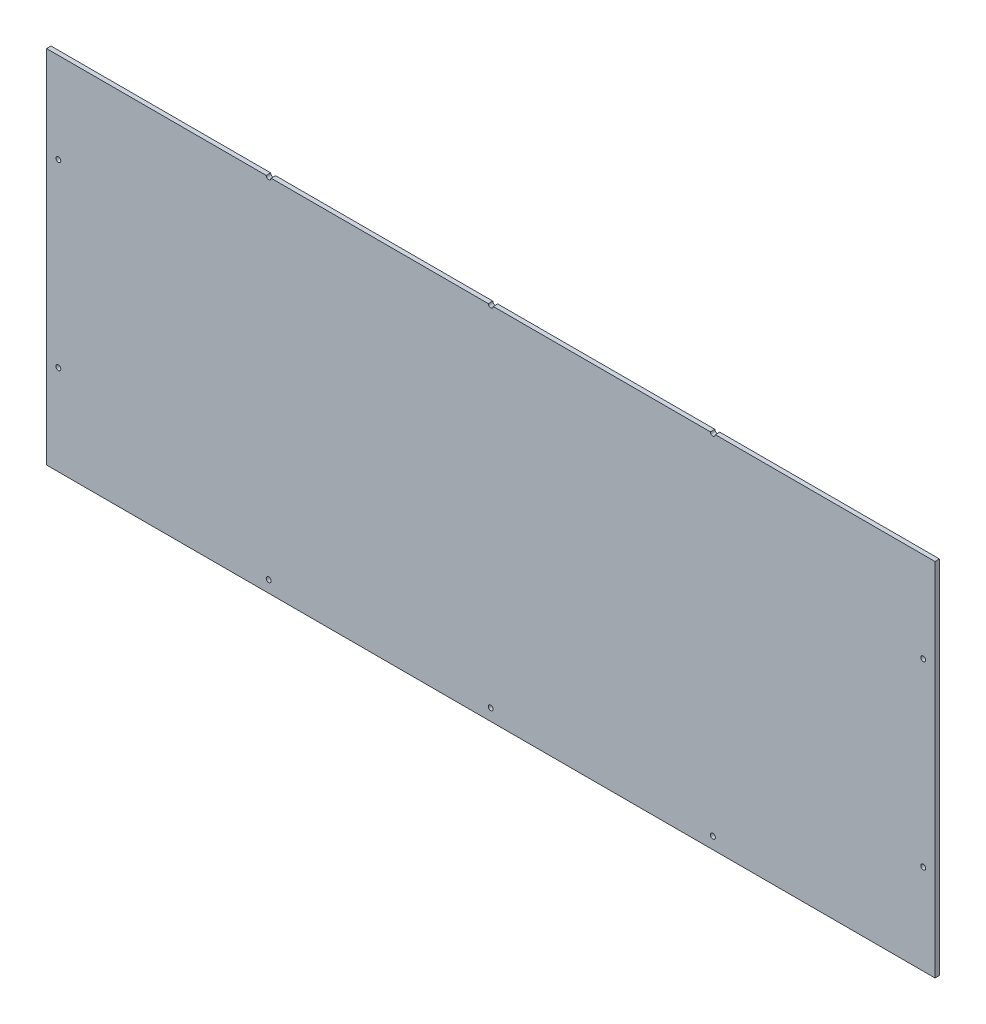
ISO-10303-21;
HEADER;
FILE_DESCRIPTION(('STEP AP214'),'2;1');
FILE_NAME('part.step','',(''),(''),'','','');
FILE_SCHEMA(('AUTOMOTIVE_DESIGN { 1 0 10303 214 1 1 1 1 }'));
ENDSEC;
DATA;
#1=APPLICATION_CONTEXT('core data for automotive mechanical design processes');
#2=APPLICATION_PROTOCOL_DEFINITION('international standard','automotive_design',2000,#1);
#3=PRODUCT_CONTEXT('',#1,'mechanical');
#4=PRODUCT('Part','Part','',(#3));
#5=PRODUCT_RELATED_PRODUCT_CATEGORY('part','',(#4));
#6=PRODUCT_DEFINITION_FORMATION('','',#4);
#7=PRODUCT_DEFINITION_CONTEXT('part definition',#1,'design');
#8=PRODUCT_DEFINITION('design','',#6,#7);
#9=PRODUCT_DEFINITION_SHAPE('','',#8);
#10=(LENGTH_UNIT() NAMED_UNIT(*) SI_UNIT(.MILLI.,.METRE.));
#11=(NAMED_UNIT(*) PLANE_ANGLE_UNIT() SI_UNIT($,.RADIAN.));
#12=(NAMED_UNIT(*) SI_UNIT($,.STERADIAN.) SOLID_ANGLE_UNIT());
#13=UNCERTAINTY_MEASURE_WITH_UNIT(LENGTH_MEASURE(1.E-05),#10,'distance_accuracy_value','');
#14=(GEOMETRIC_REPRESENTATION_CONTEXT(3) GLOBAL_UNCERTAINTY_ASSIGNED_CONTEXT((#13)) GLOBAL_UNIT_ASSIGNED_CONTEXT((#10,
#11,#12)) REPRESENTATION_CONTEXT('',''));
#15=CARTESIAN_POINT('',(0.,0.,0.));
#16=DIRECTION('',(0.,0.,1.));
#17=DIRECTION('',(1.,0.,0.));
#18=AXIS2_PLACEMENT_3D('',#15,#16,#17);
#19=CARTESIAN_POINT('',(226.,183.5,4.5));
#20=DIRECTION('',(0.,0.,1.));
#21=DIRECTION('',(1.,0.,0.));
#22=AXIS2_PLACEMENT_3D('',#19,#20,#21);
#23=PLANE('',#22);
#24=CARTESIAN_POINT('',(-439.999999999999,-91.75,4.5));
#25=DIRECTION('',(0.,0.,1.));
#26=DIRECTION('',(1.,0.,0.));
#27=AXIS2_PLACEMENT_3D('',#24,#25,#26);
#28=CIRCLE('',#27,2.50000000000002);
#29=CARTESIAN_POINT('',(-437.499999999999,-91.75,4.5));
#30=VERTEX_POINT('',#29);
#31=EDGE_CURVE('E240',#30,#30,#28,.T.);
#32=ORIENTED_EDGE('',*,*,#31,.F.);
#33=EDGE_LOOP('',(#32));
#34=FACE_BOUND('',#33,.T.);
#35=CARTESIAN_POINT('',(-440.,91.75,4.5));
#36=DIRECTION('',(0.,0.,1.));
#37=DIRECTION('',(1.,0.,0.));
#38=AXIS2_PLACEMENT_3D('',#35,#36,#37);
#39=CIRCLE('',#38,2.50000000000002);
#40=CARTESIAN_POINT('',(-437.5,91.75,4.5));
#41=VERTEX_POINT('',#40);
#42=EDGE_CURVE('E228',#41,#41,#39,.T.);
#43=ORIENTED_EDGE('',*,*,#42,.F.);
#44=EDGE_LOOP('',(#43));
#45=FACE_BOUND('',#44,.T.);
#46=CARTESIAN_POINT('',(226.,-171.499999999998,4.5));
#47=DIRECTION('',(0.,0.,1.));
#48=DIRECTION('',(1.,0.,0.));
#49=AXIS2_PLACEMENT_3D('',#46,#47,#48);
#50=CIRCLE('',#49,2.5);
#51=CARTESIAN_POINT('',(228.5,-171.499999999998,4.5));
#52=VERTEX_POINT('',#51);
#53=EDGE_CURVE('E216',#52,#52,#50,.T.);
#54=ORIENTED_EDGE('',*,*,#53,.F.);
#55=EDGE_LOOP('',(#54));
#56=FACE_BOUND('',#55,.T.);
#57=DIRECTION('',(0.,-1.,0.));
#58=VECTOR('',#57,1.);
#59=CARTESIAN_POINT('',(-452.000000000001,183.499999999997,4.5));
#60=LINE('',#59,#58);
#61=CARTESIAN_POINT('',(-452.000000000001,183.499999999997,4.5));
#62=VERTEX_POINT('',#61);
#63=CARTESIAN_POINT('',(-451.999999999999,-183.5,4.5));
#64=VERTEX_POINT('',#63);
#65=EDGE_CURVE('E165',#62,#64,#60,.T.);
#66=ORIENTED_EDGE('',*,*,#65,.T.);
#67=DIRECTION('',(1.,0.,0.));
#68=VECTOR('',#67,1.);
#69=CARTESIAN_POINT('',(-451.999999999999,-183.5,4.5));
#70=LINE('',#69,#68);
#71=CARTESIAN_POINT('',(452.000000000001,-183.499999999997,4.5));
#72=VERTEX_POINT('',#71);
#73=EDGE_CURVE('E103',#64,#72,#70,.T.);
#74=ORIENTED_EDGE('',*,*,#73,.T.);
#75=DIRECTION('',(0.,1.,0.));
#76=VECTOR('',#75,1.);
#77=CARTESIAN_POINT('',(451.999999999999,183.500000000003,4.5));
#78=LINE('',#77,#76);
#79=CARTESIAN_POINT('',(451.999999999999,183.500000000003,4.5));
#80=VERTEX_POINT('',#79);
#81=EDGE_CURVE('E186',#72,#80,#78,.T.);
#82=ORIENTED_EDGE('',*,*,#81,.T.);
#83=DIRECTION('',(-1.,0.,0.));
#84=VECTOR('',#83,1.);
#85=CARTESIAN_POINT('',(228.5,183.5,4.5));
#86=LINE('',#85,#84);
#87=CARTESIAN_POINT('',(228.5,183.5,4.5));
#88=VERTEX_POINT('',#87);
#89=EDGE_CURVE('E205',#80,#88,#86,.T.);
#90=ORIENTED_EDGE('',*,*,#89,.T.);
#91=CARTESIAN_POINT('',(226.,183.5,4.5));
#92=DIRECTION('',(0.,0.,-1.));
#93=DIRECTION('',(1.,0.,0.));
#94=AXIS2_PLACEMENT_3D('',#91,#92,#93);
#95=CIRCLE('',#94,2.5);
#96=CARTESIAN_POINT('',(223.5,183.5,4.5));
#97=VERTEX_POINT('',#96);
#98=EDGE_CURVE('E202',#88,#97,#95,.T.);
#99=ORIENTED_EDGE('',*,*,#98,.T.);
#100=DIRECTION('',(-1.,0.,0.));
#101=VECTOR('',#100,1.);
#102=CARTESIAN_POINT('',(2.50000000000006,183.5,4.5));
#103=LINE('',#102,#101);
#104=CARTESIAN_POINT('',(2.50000000000006,183.5,4.5));
#105=VERTEX_POINT('',#104);
#106=EDGE_CURVE('E204',#97,#105,#103,.T.);
#107=ORIENTED_EDGE('',*,*,#106,.T.);
#108=CARTESIAN_POINT('',(0.,183.5,4.5));
#109=DIRECTION('',(0.,0.,-1.));
#110=DIRECTION('',(1.,0.,0.));
#111=AXIS2_PLACEMENT_3D('',#108,#109,#110);
#112=CIRCLE('',#111,2.5);
#113=CARTESIAN_POINT('',(-2.49999999999995,183.5,4.5));
#114=VERTEX_POINT('',#113);
#115=EDGE_CURVE('E128',#105,#114,#112,.T.);
#116=ORIENTED_EDGE('',*,*,#115,.T.);
#117=DIRECTION('',(-1.,0.,0.));
#118=VECTOR('',#117,1.);
#119=CARTESIAN_POINT('',(-223.5,183.499999999998,4.5));
#120=LINE('',#119,#118);
#121=CARTESIAN_POINT('',(-223.5,183.499999999998,4.5));
#122=VERTEX_POINT('',#121);
#123=EDGE_CURVE('E122',#114,#122,#120,.T.);
#124=ORIENTED_EDGE('',*,*,#123,.T.);
#125=CARTESIAN_POINT('',(-226.,183.499999999998,4.5));
#126=DIRECTION('',(0.,0.,-1.));
#127=DIRECTION('',(1.,0.,0.));
#128=AXIS2_PLACEMENT_3D('',#125,#126,#127);
#129=CIRCLE('',#128,2.5);
#130=CARTESIAN_POINT('',(-228.5,183.499999999998,4.5));
#131=VERTEX_POINT('',#130);
#132=EDGE_CURVE('E126',#122,#131,#129,.T.);
#133=ORIENTED_EDGE('',*,*,#132,.T.);
#134=DIRECTION('',(-1.,0.,0.));
#135=VECTOR('',#134,1.);
#136=CARTESIAN_POINT('',(-452.000000000001,183.499999999997,4.5));
#137=LINE('',#136,#135);
#138=EDGE_CURVE('E54',#131,#62,#137,.T.);
#139=ORIENTED_EDGE('',*,*,#138,.T.);
#140=EDGE_LOOP('',(#66,#74,#82,#90,#99,#107,#116,#124,#133,#139));
#141=FACE_BOUND('',#140,.T.);
#142=CARTESIAN_POINT('',(0.,-171.499999999998,4.5));
#143=DIRECTION('',(0.,0.,1.));
#144=DIRECTION('',(1.,0.,0.));
#145=AXIS2_PLACEMENT_3D('',#142,#143,#144);
#146=CIRCLE('',#145,2.5);
#147=CARTESIAN_POINT('',(2.50000000000006,-171.499999999998,4.5));
#148=VERTEX_POINT('',#147);
#149=EDGE_CURVE('E150',#148,#148,#146,.T.);
#150=ORIENTED_EDGE('',*,*,#149,.F.);
#151=EDGE_LOOP('',(#150));
#152=FACE_BOUND('',#151,.T.);
#153=CARTESIAN_POINT('',(-226.,-171.5,4.5));
#154=DIRECTION('',(0.,0.,1.));
#155=DIRECTION('',(1.,0.,0.));
#156=AXIS2_PLACEMENT_3D('',#153,#154,#155);
#157=CIRCLE('',#156,2.5);
#158=CARTESIAN_POINT('',(-223.5,-171.5,4.5));
#159=VERTEX_POINT('',#158);
#160=EDGE_CURVE('E222',#159,#159,#157,.T.);
#161=ORIENTED_EDGE('',*,*,#160,.F.);
#162=EDGE_LOOP('',(#161));
#163=FACE_BOUND('',#162,.T.);
#164=CARTESIAN_POINT('',(439.999999999999,-91.75,4.5));
#165=DIRECTION('',(0.,0.,1.));
#166=DIRECTION('',(-1.,0.,0.));
#167=AXIS2_PLACEMENT_3D('',#164,#165,#166);
#168=CIRCLE('',#167,2.50000000000002);
#169=CARTESIAN_POINT('',(437.499999999999,-91.75,4.5));
#170=VERTEX_POINT('',#169);
#171=EDGE_CURVE('E234',#170,#170,#168,.T.);
#172=ORIENTED_EDGE('',*,*,#171,.F.);
#173=EDGE_LOOP('',(#172));
#174=FACE_BOUND('',#173,.T.);
#175=CARTESIAN_POINT('',(440.,91.75,4.5));
#176=DIRECTION('',(0.,0.,1.));
#177=DIRECTION('',(-1.,0.,0.));
#178=AXIS2_PLACEMENT_3D('',#175,#176,#177);
#179=CIRCLE('',#178,2.50000000000002);
#180=CARTESIAN_POINT('',(437.5,91.75,4.5));
#181=VERTEX_POINT('',#180);
#182=EDGE_CURVE('E246',#181,#181,#179,.T.);
#183=ORIENTED_EDGE('',*,*,#182,.F.);
#184=EDGE_LOOP('',(#183));
#185=FACE_BOUND('',#184,.T.);
#186=ADVANCED_FACE('F37',(#34,#45,#56,#141,#152,#163,#174,#185),#23,.T.);
#187=CARTESIAN_POINT('',(226.,183.5,0.));
#188=DIRECTION('',(0.,0.,1.));
#189=DIRECTION('',(1.,0.,0.));
#190=AXIS2_PLACEMENT_3D('',#187,#188,#189);
#191=PLANE('',#190);
#192=DIRECTION('',(0.,-1.,0.));
#193=VECTOR('',#192,1.);
#194=CARTESIAN_POINT('',(-452.000000000001,183.499999999997,0.));
#195=LINE('',#194,#193);
#196=CARTESIAN_POINT('',(-452.000000000001,183.499999999997,0.));
#197=VERTEX_POINT('',#196);
#198=CARTESIAN_POINT('',(-451.999999999999,-183.5,0.));
#199=VERTEX_POINT('',#198);
#200=EDGE_CURVE('E146',#197,#199,#195,.T.);
#201=ORIENTED_EDGE('',*,*,#200,.F.);
#202=DIRECTION('',(-1.,0.,0.));
#203=VECTOR('',#202,1.);
#204=CARTESIAN_POINT('',(-452.000000000001,183.499999999997,0.));
#205=LINE('',#204,#203);
#206=CARTESIAN_POINT('',(-228.5,183.499999999998,0.));
#207=VERTEX_POINT('',#206);
#208=EDGE_CURVE('E95',#207,#197,#205,.T.);
#209=ORIENTED_EDGE('',*,*,#208,.F.);
#210=CARTESIAN_POINT('',(-226.,183.499999999998,0.));
#211=DIRECTION('',(0.,0.,-1.));
#212=DIRECTION('',(1.,0.,0.));
#213=AXIS2_PLACEMENT_3D('',#210,#211,#212);
#214=CIRCLE('',#213,2.5);
#215=CARTESIAN_POINT('',(-223.5,183.499999999998,0.));
#216=VERTEX_POINT('',#215);
#217=EDGE_CURVE('E89',#216,#207,#214,.T.);
#218=ORIENTED_EDGE('',*,*,#217,.F.);
#219=DIRECTION('',(-1.,0.,0.));
#220=VECTOR('',#219,1.);
#221=CARTESIAN_POINT('',(-223.5,183.499999999998,0.));
#222=LINE('',#221,#220);
#223=CARTESIAN_POINT('',(-2.49999999999995,183.5,0.));
#224=VERTEX_POINT('',#223);
#225=EDGE_CURVE('E136',#224,#216,#222,.T.);
#226=ORIENTED_EDGE('',*,*,#225,.F.);
#227=CARTESIAN_POINT('',(0.,183.5,0.));
#228=DIRECTION('',(0.,0.,-1.));
#229=DIRECTION('',(1.,0.,0.));
#230=AXIS2_PLACEMENT_3D('',#227,#228,#229);
#231=CIRCLE('',#230,2.5);
#232=CARTESIAN_POINT('',(2.50000000000006,183.5,0.));
#233=VERTEX_POINT('',#232);
#234=EDGE_CURVE('E160',#233,#224,#231,.T.);
#235=ORIENTED_EDGE('',*,*,#234,.F.);
#236=DIRECTION('',(-1.,0.,0.));
#237=VECTOR('',#236,1.);
#238=CARTESIAN_POINT('',(2.50000000000006,183.5,0.));
#239=LINE('',#238,#237);
#240=CARTESIAN_POINT('',(223.5,183.5,0.));
#241=VERTEX_POINT('',#240);
#242=EDGE_CURVE('E158',#241,#233,#239,.T.);
#243=ORIENTED_EDGE('',*,*,#242,.F.);
#244=CARTESIAN_POINT('',(226.,183.5,0.));
#245=DIRECTION('',(0.,0.,-1.));
#246=DIRECTION('',(1.,0.,0.));
#247=AXIS2_PLACEMENT_3D('',#244,#245,#246);
#248=CIRCLE('',#247,2.5);
#249=CARTESIAN_POINT('',(228.5,183.5,0.));
#250=VERTEX_POINT('',#249);
#251=EDGE_CURVE('E156',#250,#241,#248,.T.);
#252=ORIENTED_EDGE('',*,*,#251,.F.);
#253=DIRECTION('',(-1.,0.,0.));
#254=VECTOR('',#253,1.);
#255=CARTESIAN_POINT('',(228.5,183.5,0.));
#256=LINE('',#255,#254);
#257=CARTESIAN_POINT('',(451.999999999999,183.500000000003,0.));
#258=VERTEX_POINT('',#257);
#259=EDGE_CURVE('E154',#258,#250,#256,.T.);
#260=ORIENTED_EDGE('',*,*,#259,.F.);
#261=DIRECTION('',(0.,1.,0.));
#262=VECTOR('',#261,1.);
#263=CARTESIAN_POINT('',(451.999999999999,183.500000000003,0.));
#264=LINE('',#263,#262);
#265=CARTESIAN_POINT('',(452.000000000001,-183.499999999997,0.));
#266=VERTEX_POINT('',#265);
#267=EDGE_CURVE('E152',#266,#258,#264,.T.);
#268=ORIENTED_EDGE('',*,*,#267,.F.);
#269=DIRECTION('',(1.,0.,0.));
#270=VECTOR('',#269,1.);
#271=CARTESIAN_POINT('',(-451.999999999999,-183.5,0.));
#272=LINE('',#271,#270);
#273=EDGE_CURVE('E149',#199,#266,#272,.T.);
#274=ORIENTED_EDGE('',*,*,#273,.F.);
#275=EDGE_LOOP('',(#201,#209,#218,#226,#235,#243,#252,#260,#268,#274));
#276=FACE_BOUND('',#275,.T.);
#277=CARTESIAN_POINT('',(0.,-171.499999999998,0.));
#278=DIRECTION('',(0.,0.,1.));
#279=DIRECTION('',(1.,0.,0.));
#280=AXIS2_PLACEMENT_3D('',#277,#278,#279);
#281=CIRCLE('',#280,2.5);
#282=CARTESIAN_POINT('',(2.50000000000006,-171.499999999998,0.));
#283=VERTEX_POINT('',#282);
#284=EDGE_CURVE('E213',#283,#283,#281,.T.);
#285=ORIENTED_EDGE('',*,*,#284,.T.);
#286=EDGE_LOOP('',(#285));
#287=FACE_BOUND('',#286,.T.);
#288=CARTESIAN_POINT('',(226.,-171.499999999998,0.));
#289=DIRECTION('',(0.,0.,1.));
#290=DIRECTION('',(1.,0.,0.));
#291=AXIS2_PLACEMENT_3D('',#288,#289,#290);
#292=CIRCLE('',#291,2.5);
#293=CARTESIAN_POINT('',(228.5,-171.499999999998,0.));
#294=VERTEX_POINT('',#293);
#295=EDGE_CURVE('E219',#294,#294,#292,.T.);
#296=ORIENTED_EDGE('',*,*,#295,.T.);
#297=EDGE_LOOP('',(#296));
#298=FACE_BOUND('',#297,.T.);
#299=CARTESIAN_POINT('',(-226.,-171.5,0.));
#300=DIRECTION('',(0.,0.,1.));
#301=DIRECTION('',(1.,0.,0.));
#302=AXIS2_PLACEMENT_3D('',#299,#300,#301);
#303=CIRCLE('',#302,2.5);
#304=CARTESIAN_POINT('',(-223.5,-171.5,0.));
#305=VERTEX_POINT('',#304);
#306=EDGE_CURVE('E225',#305,#305,#303,.T.);
#307=ORIENTED_EDGE('',*,*,#306,.T.);
#308=EDGE_LOOP('',(#307));
#309=FACE_BOUND('',#308,.T.);
#310=CARTESIAN_POINT('',(-440.,91.75,0.));
#311=DIRECTION('',(0.,0.,1.));
#312=DIRECTION('',(1.,0.,0.));
#313=AXIS2_PLACEMENT_3D('',#310,#311,#312);
#314=CIRCLE('',#313,2.50000000000002);
#315=CARTESIAN_POINT('',(-437.5,91.75,0.));
#316=VERTEX_POINT('',#315);
#317=EDGE_CURVE('E231',#316,#316,#314,.T.);
#318=ORIENTED_EDGE('',*,*,#317,.T.);
#319=EDGE_LOOP('',(#318));
#320=FACE_BOUND('',#319,.T.);
#321=CARTESIAN_POINT('',(439.999999999999,-91.75,0.));
#322=DIRECTION('',(0.,0.,1.));
#323=DIRECTION('',(-1.,0.,0.));
#324=AXIS2_PLACEMENT_3D('',#321,#322,#323);
#325=CIRCLE('',#324,2.50000000000002);
#326=CARTESIAN_POINT('',(437.499999999999,-91.75,0.));
#327=VERTEX_POINT('',#326);
#328=EDGE_CURVE('E237',#327,#327,#325,.T.);
#329=ORIENTED_EDGE('',*,*,#328,.T.);
#330=EDGE_LOOP('',(#329));
#331=FACE_BOUND('',#330,.T.);
#332=CARTESIAN_POINT('',(-439.999999999999,-91.75,0.));
#333=DIRECTION('',(0.,0.,1.));
#334=DIRECTION('',(1.,0.,0.));
#335=AXIS2_PLACEMENT_3D('',#332,#333,#334);
#336=CIRCLE('',#335,2.50000000000002);
#337=CARTESIAN_POINT('',(-437.499999999999,-91.75,0.));
#338=VERTEX_POINT('',#337);
#339=EDGE_CURVE('E243',#338,#338,#336,.T.);
#340=ORIENTED_EDGE('',*,*,#339,.T.);
#341=EDGE_LOOP('',(#340));
#342=FACE_BOUND('',#341,.T.);
#343=CARTESIAN_POINT('',(440.,91.75,0.));
#344=DIRECTION('',(0.,0.,1.));
#345=DIRECTION('',(-1.,0.,0.));
#346=AXIS2_PLACEMENT_3D('',#343,#344,#345);
#347=CIRCLE('',#346,2.50000000000002);
#348=CARTESIAN_POINT('',(437.5,91.75,0.));
#349=VERTEX_POINT('',#348);
#350=EDGE_CURVE('E249',#349,#349,#347,.T.);
#351=ORIENTED_EDGE('',*,*,#350,.T.);
#352=EDGE_LOOP('',(#351));
#353=FACE_BOUND('',#352,.T.);
#354=ADVANCED_FACE('F190',(#276,#287,#298,#309,#320,#331,#342,#353),#191,.F.);
#355=CARTESIAN_POINT('',(-452.000000000001,183.499999999997,4.5));
#356=DIRECTION('',(1.,0.,0.));
#357=DIRECTION('',(0.,1.,0.));
#358=AXIS2_PLACEMENT_3D('',#355,#356,#357);
#359=PLANE('',#358);
#360=ORIENTED_EDGE('',*,*,#200,.T.);
#361=DIRECTION('',(0.,0.,-1.));
#362=VECTOR('',#361,1.);
#363=CARTESIAN_POINT('',(-451.999999999999,-183.5,4.5));
#364=LINE('',#363,#362);
#365=EDGE_CURVE('E11',#64,#199,#364,.T.);
#366=ORIENTED_EDGE('',*,*,#365,.F.);
#367=ORIENTED_EDGE('',*,*,#65,.F.);
#368=DIRECTION('',(0.,0.,-1.));
#369=VECTOR('',#368,1.);
#370=CARTESIAN_POINT('',(-452.000000000001,183.499999999997,4.5));
#371=LINE('',#370,#369);
#372=EDGE_CURVE('E142',#62,#197,#371,.T.);
#373=ORIENTED_EDGE('',*,*,#372,.T.);
#374=EDGE_LOOP('',(#360,#366,#367,#373));
#375=FACE_BOUND('',#374,.T.);
#376=ADVANCED_FACE('F39',(#375),#359,.F.);
#377=CARTESIAN_POINT('',(-451.999999999999,-183.5,4.5));
#378=DIRECTION('',(0.,1.,0.));
#379=DIRECTION('',(-1.,0.,0.));
#380=AXIS2_PLACEMENT_3D('',#377,#378,#379);
#381=PLANE('',#380);
#382=ORIENTED_EDGE('',*,*,#273,.T.);
#383=DIRECTION('',(0.,0.,-1.));
#384=VECTOR('',#383,1.);
#385=CARTESIAN_POINT('',(452.000000000001,-183.499999999997,4.5));
#386=LINE('',#385,#384);
#387=EDGE_CURVE('E46',#72,#266,#386,.T.);
#388=ORIENTED_EDGE('',*,*,#387,.F.);
#389=ORIENTED_EDGE('',*,*,#73,.F.);
#390=ORIENTED_EDGE('',*,*,#365,.T.);
#391=EDGE_LOOP('',(#382,#388,#389,#390));
#392=FACE_BOUND('',#391,.T.);
#393=ADVANCED_FACE('F291',(#392),#381,.F.);
#394=CARTESIAN_POINT('',(451.999999999999,183.500000000003,4.5));
#395=DIRECTION('',(-1.,0.,0.));
#396=DIRECTION('',(0.,-1.,0.));
#397=AXIS2_PLACEMENT_3D('',#394,#395,#396);
#398=PLANE('',#397);
#399=ORIENTED_EDGE('',*,*,#267,.T.);
#400=DIRECTION('',(0.,0.,-1.));
#401=VECTOR('',#400,1.);
#402=CARTESIAN_POINT('',(451.999999999999,183.500000000003,4.5));
#403=LINE('',#402,#401);
#404=EDGE_CURVE('E178',#80,#258,#403,.T.);
#405=ORIENTED_EDGE('',*,*,#404,.F.);
#406=ORIENTED_EDGE('',*,*,#81,.F.);
#407=ORIENTED_EDGE('',*,*,#387,.T.);
#408=EDGE_LOOP('',(#399,#405,#406,#407));
#409=FACE_BOUND('',#408,.T.);
#410=ADVANCED_FACE('F184',(#409),#398,.F.);
#411=CARTESIAN_POINT('',(228.5,183.5,4.5));
#412=DIRECTION('',(0.,-1.,0.));
#413=DIRECTION('',(1.,0.,0.));
#414=AXIS2_PLACEMENT_3D('',#411,#412,#413);
#415=PLANE('',#414);
#416=ORIENTED_EDGE('',*,*,#259,.T.);
#417=DIRECTION('',(0.,0.,-1.));
#418=VECTOR('',#417,1.);
#419=CARTESIAN_POINT('',(228.5,183.5,4.5));
#420=LINE('',#419,#418);
#421=EDGE_CURVE('E175',#88,#250,#420,.T.);
#422=ORIENTED_EDGE('',*,*,#421,.F.);
#423=ORIENTED_EDGE('',*,*,#89,.F.);
#424=ORIENTED_EDGE('',*,*,#404,.T.);
#425=EDGE_LOOP('',(#416,#422,#423,#424));
#426=FACE_BOUND('',#425,.T.);
#427=ADVANCED_FACE('F196',(#426),#415,.F.);
#428=CARTESIAN_POINT('',(226.,183.5,4.5));
#429=DIRECTION('',(0.,0.,-1.));
#430=DIRECTION('',(-1.,0.,0.));
#431=AXIS2_PLACEMENT_3D('',#428,#429,#430);
#432=CYLINDRICAL_SURFACE('',#431,2.5);
#433=ORIENTED_EDGE('',*,*,#251,.T.);
#434=DIRECTION('',(0.,0.,-1.));
#435=VECTOR('',#434,1.);
#436=CARTESIAN_POINT('',(223.5,183.5,4.5));
#437=LINE('',#436,#435);
#438=EDGE_CURVE('E172',#97,#241,#437,.T.);
#439=ORIENTED_EDGE('',*,*,#438,.F.);
#440=ORIENTED_EDGE('',*,*,#98,.F.);
#441=ORIENTED_EDGE('',*,*,#421,.T.);
#442=EDGE_LOOP('',(#433,#439,#440,#441));
#443=FACE_BOUND('',#442,.T.);
#444=ADVANCED_FACE('F200',(#443),#432,.F.);
#445=CARTESIAN_POINT('',(2.50000000000006,183.5,4.5));
#446=DIRECTION('',(0.,-1.,0.));
#447=DIRECTION('',(0.,0.,-1.));
#448=AXIS2_PLACEMENT_3D('',#445,#446,#447);
#449=PLANE('',#448);
#450=ORIENTED_EDGE('',*,*,#242,.T.);
#451=DIRECTION('',(0.,0.,-1.));
#452=VECTOR('',#451,1.);
#453=CARTESIAN_POINT('',(2.50000000000006,183.5,4.5));
#454=LINE('',#453,#452);
#455=EDGE_CURVE('E169',#105,#233,#454,.T.);
#456=ORIENTED_EDGE('',*,*,#455,.F.);
#457=ORIENTED_EDGE('',*,*,#106,.F.);
#458=ORIENTED_EDGE('',*,*,#438,.T.);
#459=EDGE_LOOP('',(#450,#456,#457,#458));
#460=FACE_BOUND('',#459,.T.);
#461=ADVANCED_FACE('F281',(#460),#449,.F.);
#462=CARTESIAN_POINT('',(0.,183.5,4.5));
#463=DIRECTION('',(0.,0.,-1.));
#464=DIRECTION('',(-1.,0.,0.));
#465=AXIS2_PLACEMENT_3D('',#462,#463,#464);
#466=CYLINDRICAL_SURFACE('',#465,2.5);
#467=ORIENTED_EDGE('',*,*,#234,.T.);
#468=DIRECTION('',(0.,0.,-1.));
#469=VECTOR('',#468,1.);
#470=CARTESIAN_POINT('',(-2.49999999999995,183.5,4.5));
#471=LINE('',#470,#469);
#472=EDGE_CURVE('E137',#114,#224,#471,.T.);
#473=ORIENTED_EDGE('',*,*,#472,.F.);
#474=ORIENTED_EDGE('',*,*,#115,.F.);
#475=ORIENTED_EDGE('',*,*,#455,.T.);
#476=EDGE_LOOP('',(#467,#473,#474,#475));
#477=FACE_BOUND('',#476,.T.);
#478=ADVANCED_FACE('F278',(#477),#466,.F.);
#479=CARTESIAN_POINT('',(-223.5,183.499999999998,4.5));
#480=DIRECTION('',(0.,-1.,0.));
#481=DIRECTION('',(1.,0.,0.));
#482=AXIS2_PLACEMENT_3D('',#479,#480,#481);
#483=PLANE('',#482);
#484=ORIENTED_EDGE('',*,*,#225,.T.);
#485=DIRECTION('',(0.,0.,-1.));
#486=VECTOR('',#485,1.);
#487=CARTESIAN_POINT('',(-223.5,183.499999999998,4.5));
#488=LINE('',#487,#486);
#489=EDGE_CURVE('E133',#122,#216,#488,.T.);
#490=ORIENTED_EDGE('',*,*,#489,.F.);
#491=ORIENTED_EDGE('',*,*,#123,.F.);
#492=ORIENTED_EDGE('',*,*,#472,.T.);
#493=EDGE_LOOP('',(#484,#490,#491,#492));
#494=FACE_BOUND('',#493,.T.);
#495=ADVANCED_FACE('F134',(#494),#483,.F.);
#496=CARTESIAN_POINT('',(-226.,183.499999999998,4.5));
#497=DIRECTION('',(0.,0.,-1.));
#498=DIRECTION('',(-1.,0.,0.));
#499=AXIS2_PLACEMENT_3D('',#496,#497,#498);
#500=CYLINDRICAL_SURFACE('',#499,2.5);
#501=ORIENTED_EDGE('',*,*,#217,.T.);
#502=DIRECTION('',(0.,0.,-1.));
#503=VECTOR('',#502,1.);
#504=CARTESIAN_POINT('',(-228.5,183.499999999998,4.5));
#505=LINE('',#504,#503);
#506=EDGE_CURVE('E138',#131,#207,#505,.T.);
#507=ORIENTED_EDGE('',*,*,#506,.F.);
#508=ORIENTED_EDGE('',*,*,#132,.F.);
#509=ORIENTED_EDGE('',*,*,#489,.T.);
#510=EDGE_LOOP('',(#501,#507,#508,#509));
#511=FACE_BOUND('',#510,.T.);
#512=ADVANCED_FACE('F140',(#511),#500,.F.);
#513=CARTESIAN_POINT('',(-452.000000000001,183.499999999997,4.5));
#514=DIRECTION('',(0.,-1.,0.));
#515=DIRECTION('',(1.,0.,0.));
#516=AXIS2_PLACEMENT_3D('',#513,#514,#515);
#517=PLANE('',#516);
#518=ORIENTED_EDGE('',*,*,#208,.T.);
#519=ORIENTED_EDGE('',*,*,#372,.F.);
#520=ORIENTED_EDGE('',*,*,#138,.F.);
#521=ORIENTED_EDGE('',*,*,#506,.T.);
#522=EDGE_LOOP('',(#518,#519,#520,#521));
#523=FACE_BOUND('',#522,.T.);
#524=ADVANCED_FACE('F271',(#523),#517,.F.);
#525=CARTESIAN_POINT('',(0.,-171.499999999998,4.5));
#526=DIRECTION('',(0.,0.,-1.));
#527=DIRECTION('',(-1.,0.,0.));
#528=AXIS2_PLACEMENT_3D('',#525,#526,#527);
#529=CYLINDRICAL_SURFACE('',#528,2.5);
#530=ORIENTED_EDGE('',*,*,#149,.T.);
#531=EDGE_LOOP('',(#530));
#532=FACE_BOUND('',#531,.T.);
#533=ORIENTED_EDGE('',*,*,#284,.F.);
#534=EDGE_LOOP('',(#533));
#535=FACE_BOUND('',#534,.T.);
#536=ADVANCED_FACE('F268',(#532,#535),#529,.F.);
#537=CARTESIAN_POINT('',(226.,-171.499999999998,4.5));
#538=DIRECTION('',(0.,0.,-1.));
#539=DIRECTION('',(-1.,0.,0.));
#540=AXIS2_PLACEMENT_3D('',#537,#538,#539);
#541=CYLINDRICAL_SURFACE('',#540,2.5);
#542=ORIENTED_EDGE('',*,*,#53,.T.);
#543=EDGE_LOOP('',(#542));
#544=FACE_BOUND('',#543,.T.);
#545=ORIENTED_EDGE('',*,*,#295,.F.);
#546=EDGE_LOOP('',(#545));
#547=FACE_BOUND('',#546,.T.);
#548=ADVANCED_FACE('F367',(#544,#547),#541,.F.);
#549=CARTESIAN_POINT('',(-226.,-171.5,4.5));
#550=DIRECTION('',(0.,0.,-1.));
#551=DIRECTION('',(-1.,0.,0.));
#552=AXIS2_PLACEMENT_3D('',#549,#550,#551);
#553=CYLINDRICAL_SURFACE('',#552,2.5);
#554=ORIENTED_EDGE('',*,*,#160,.T.);
#555=EDGE_LOOP('',(#554));
#556=FACE_BOUND('',#555,.T.);
#557=ORIENTED_EDGE('',*,*,#306,.F.);
#558=EDGE_LOOP('',(#557));
#559=FACE_BOUND('',#558,.T.);
#560=ADVANCED_FACE('F375',(#556,#559),#553,.F.);
#561=CARTESIAN_POINT('',(-440.,91.75,4.5));
#562=DIRECTION('',(0.,0.,-1.));
#563=DIRECTION('',(-1.,0.,0.));
#564=AXIS2_PLACEMENT_3D('',#561,#562,#563);
#565=CYLINDRICAL_SURFACE('',#564,2.50000000000002);
#566=ORIENTED_EDGE('',*,*,#42,.T.);
#567=EDGE_LOOP('',(#566));
#568=FACE_BOUND('',#567,.T.);
#569=ORIENTED_EDGE('',*,*,#317,.F.);
#570=EDGE_LOOP('',(#569));
#571=FACE_BOUND('',#570,.T.);
#572=ADVANCED_FACE('F383',(#568,#571),#565,.F.);
#573=CARTESIAN_POINT('',(439.999999999999,-91.75,4.5));
#574=DIRECTION('',(0.,0.,-1.));
#575=DIRECTION('',(-1.,0.,0.));
#576=AXIS2_PLACEMENT_3D('',#573,#574,#575);
#577=CYLINDRICAL_SURFACE('',#576,2.50000000000002);
#578=ORIENTED_EDGE('',*,*,#171,.T.);
#579=EDGE_LOOP('',(#578));
#580=FACE_BOUND('',#579,.T.);
#581=ORIENTED_EDGE('',*,*,#328,.F.);
#582=EDGE_LOOP('',(#581));
#583=FACE_BOUND('',#582,.T.);
#584=ADVANCED_FACE('F392',(#580,#583),#577,.F.);
#585=CARTESIAN_POINT('',(-439.999999999999,-91.75,4.5));
#586=DIRECTION('',(0.,0.,-1.));
#587=DIRECTION('',(-1.,0.,0.));
#588=AXIS2_PLACEMENT_3D('',#585,#586,#587);
#589=CYLINDRICAL_SURFACE('',#588,2.50000000000002);
#590=ORIENTED_EDGE('',*,*,#31,.T.);
#591=EDGE_LOOP('',(#590));
#592=FACE_BOUND('',#591,.T.);
#593=ORIENTED_EDGE('',*,*,#339,.F.);
#594=EDGE_LOOP('',(#593));
#595=FACE_BOUND('',#594,.T.);
#596=ADVANCED_FACE('F401',(#592,#595),#589,.F.);
#597=CARTESIAN_POINT('',(440.,91.75,4.5));
#598=DIRECTION('',(0.,0.,-1.));
#599=DIRECTION('',(-1.,0.,0.));
#600=AXIS2_PLACEMENT_3D('',#597,#598,#599);
#601=CYLINDRICAL_SURFACE('',#600,2.50000000000002);
#602=ORIENTED_EDGE('',*,*,#182,.T.);
#603=EDGE_LOOP('',(#602));
#604=FACE_BOUND('',#603,.T.);
#605=ORIENTED_EDGE('',*,*,#350,.F.);
#606=EDGE_LOOP('',(#605));
#607=FACE_BOUND('',#606,.T.);
#608=ADVANCED_FACE('F255',(#604,#607),#601,.F.);
#609=CLOSED_SHELL('',(#186,#354,#376,#393,#410,#427,#444,#461,#478,#495,#512,#524,#536,#548,
#560,#572,#584,#596,#608));
#610=MANIFOLD_SOLID_BREP('B2',#609);
#611=ADVANCED_BREP_SHAPE_REPRESENTATION('',(#18,#610),#14);
#612=SHAPE_DEFINITION_REPRESENTATION(#9,#611);
ENDSEC;
END-ISO-10303-21;
